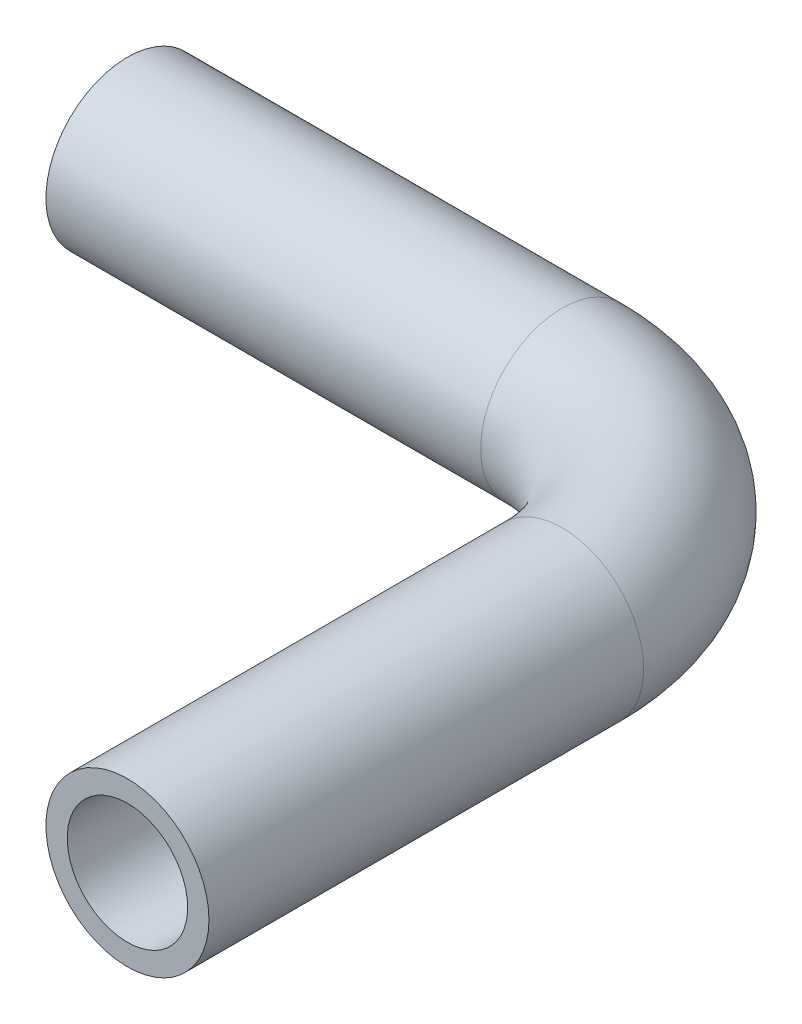
ISO-10303-21;
HEADER;
FILE_DESCRIPTION(('STEP AP214'),'2;1');
FILE_NAME('part.step','',(''),(''),'','','');
FILE_SCHEMA(('AUTOMOTIVE_DESIGN { 1 0 10303 214 1 1 1 1 }'));
ENDSEC;
DATA;
#1=APPLICATION_CONTEXT('core data for automotive mechanical design processes');
#2=APPLICATION_PROTOCOL_DEFINITION('international standard','automotive_design',2000,#1);
#3=PRODUCT_CONTEXT('',#1,'mechanical');
#4=PRODUCT('Part','Part','',(#3));
#5=PRODUCT_RELATED_PRODUCT_CATEGORY('part','',(#4));
#6=PRODUCT_DEFINITION_FORMATION('','',#4);
#7=PRODUCT_DEFINITION_CONTEXT('part definition',#1,'design');
#8=PRODUCT_DEFINITION('design','',#6,#7);
#9=PRODUCT_DEFINITION_SHAPE('','',#8);
#10=(LENGTH_UNIT() NAMED_UNIT(*) SI_UNIT(.MILLI.,.METRE.));
#11=(NAMED_UNIT(*) PLANE_ANGLE_UNIT() SI_UNIT($,.RADIAN.));
#12=(NAMED_UNIT(*) SI_UNIT($,.STERADIAN.) SOLID_ANGLE_UNIT());
#13=UNCERTAINTY_MEASURE_WITH_UNIT(LENGTH_MEASURE(1.E-05),#10,'distance_accuracy_value','');
#14=(GEOMETRIC_REPRESENTATION_CONTEXT(3) GLOBAL_UNCERTAINTY_ASSIGNED_CONTEXT((#13)) GLOBAL_UNIT_ASSIGNED_CONTEXT((#10,
#11,#12)) REPRESENTATION_CONTEXT('',''));
#15=CARTESIAN_POINT('',(0.,0.,0.));
#16=DIRECTION('',(0.,0.,1.));
#17=DIRECTION('',(1.,0.,0.));
#18=AXIS2_PLACEMENT_3D('',#15,#16,#17);
#19=CARTESIAN_POINT('',(-12.7,0.,0.));
#20=DIRECTION('',(1.,0.,0.));
#21=DIRECTION('',(0.,0.,-1.));
#22=AXIS2_PLACEMENT_3D('',#19,#20,#21);
#23=PLANE('',#22);
#24=CARTESIAN_POINT('',(-12.7,0.,0.));
#25=DIRECTION('',(1.,0.,0.));
#26=DIRECTION('',(0.,0.,-1.));
#27=AXIS2_PLACEMENT_3D('',#24,#25,#26);
#28=CIRCLE('',#27,4.7625);
#29=CARTESIAN_POINT('',(-12.7,0.,-4.7625));
#30=VERTEX_POINT('',#29);
#31=EDGE_CURVE('E39',#30,#30,#28,.T.);
#32=ORIENTED_EDGE('',*,*,#31,.F.);
#33=EDGE_LOOP('',(#32));
#34=FACE_BOUND('',#33,.T.);
#35=CARTESIAN_POINT('',(-12.7,0.,0.));
#36=DIRECTION('',(1.,0.,0.));
#37=DIRECTION('',(0.,0.,-1.));
#38=AXIS2_PLACEMENT_3D('',#35,#36,#37);
#39=CIRCLE('',#38,3.5179);
#40=CARTESIAN_POINT('',(-12.7,0.,-3.5179));
#41=VERTEX_POINT('',#40);
#42=EDGE_CURVE('E46',#41,#41,#39,.T.);
#43=ORIENTED_EDGE('',*,*,#42,.T.);
#44=EDGE_LOOP('',(#43));
#45=FACE_BOUND('',#44,.T.);
#46=ADVANCED_FACE('F35',(#34,#45),#23,.F.);
#47=CARTESIAN_POINT('',(12.7,0.,0.));
#48=DIRECTION('',(-1.,0.,0.));
#49=DIRECTION('',(0.,0.,1.));
#50=AXIS2_PLACEMENT_3D('',#47,#48,#49);
#51=CYLINDRICAL_SURFACE('',#50,4.7625);
#52=CARTESIAN_POINT('',(12.7,0.,0.));
#53=DIRECTION('',(1.,0.,0.));
#54=DIRECTION('',(0.,0.,-1.));
#55=AXIS2_PLACEMENT_3D('',#52,#53,#54);
#56=CIRCLE('',#55,4.7625);
#57=CARTESIAN_POINT('',(12.7,0.,-4.7625));
#58=VERTEX_POINT('',#57);
#59=EDGE_CURVE('E10',#58,#58,#56,.T.);
#60=ORIENTED_EDGE('',*,*,#59,.F.);
#61=EDGE_LOOP('',(#60));
#62=FACE_BOUND('',#61,.T.);
#63=ORIENTED_EDGE('',*,*,#31,.T.);
#64=EDGE_LOOP('',(#63));
#65=FACE_BOUND('',#64,.T.);
#66=ADVANCED_FACE('F37',(#62,#65),#51,.T.);
#67=CARTESIAN_POINT('',(12.7,0.,0.));
#68=DIRECTION('',(-1.,0.,0.));
#69=DIRECTION('',(0.,0.,1.));
#70=AXIS2_PLACEMENT_3D('',#67,#68,#69);
#71=CYLINDRICAL_SURFACE('',#70,3.5179);
#72=CARTESIAN_POINT('',(12.7,0.,0.));
#73=DIRECTION('',(1.,0.,0.));
#74=DIRECTION('',(0.,0.,-1.));
#75=AXIS2_PLACEMENT_3D('',#72,#73,#74);
#76=CIRCLE('',#75,3.5179);
#77=CARTESIAN_POINT('',(12.7,0.,-3.5179));
#78=VERTEX_POINT('',#77);
#79=EDGE_CURVE('E54',#78,#78,#76,.F.);
#80=ORIENTED_EDGE('',*,*,#79,.F.);
#81=EDGE_LOOP('',(#80));
#82=FACE_BOUND('',#81,.T.);
#83=ORIENTED_EDGE('',*,*,#42,.F.);
#84=EDGE_LOOP('',(#83));
#85=FACE_BOUND('',#84,.T.);
#86=ADVANCED_FACE('F84',(#82,#85),#71,.F.);
#87=CARTESIAN_POINT('',(12.7,0.,11.1125));
#88=DIRECTION('',(0.,-1.,0.));
#89=DIRECTION('',(0.,0.,-1.));
#90=AXIS2_PLACEMENT_3D('',#87,#88,#89);
#91=TOROIDAL_SURFACE('',#90,11.1125,4.7625);
#92=CARTESIAN_POINT('',(23.8125,0.,11.1125));
#93=DIRECTION('',(0.,0.,1.));
#94=DIRECTION('',(1.,0.,0.));
#95=AXIS2_PLACEMENT_3D('',#92,#93,#94);
#96=CIRCLE('',#95,4.7625);
#97=CARTESIAN_POINT('',(28.575,0.,11.1125));
#98=VERTEX_POINT('',#97);
#99=EDGE_CURVE('E51',#98,#98,#96,.T.);
#100=CARTESIAN_POINT('',(12.7,0.,11.1125));
#101=DIRECTION('',(0.,-1.,0.));
#102=DIRECTION('',(0.,0.,-1.));
#103=AXIS2_PLACEMENT_3D('',#100,#101,#102);
#104=CIRCLE('',#103,15.875);
#105=EDGE_CURVE('',#58,#98,#104,.T.);
#106=ORIENTED_EDGE('',*,*,#59,.T.);
#107=ORIENTED_EDGE('',*,*,#99,.F.);
#108=ORIENTED_EDGE('',*,*,#105,.T.);
#109=ORIENTED_EDGE('',*,*,#105,.F.);
#110=EDGE_LOOP('',(#106,#108,#107,#109));
#111=FACE_BOUND('',#110,.T.);
#112=ADVANCED_FACE('F75',(#111),#91,.T.);
#113=CARTESIAN_POINT('',(12.7,0.,11.1125));
#114=DIRECTION('',(0.,-1.,0.));
#115=DIRECTION('',(0.,0.,-1.));
#116=AXIS2_PLACEMENT_3D('',#113,#114,#115);
#117=TOROIDAL_SURFACE('',#116,11.1125,3.5179);
#118=CARTESIAN_POINT('',(23.8125,0.,11.1125));
#119=DIRECTION('',(0.,0.,1.));
#120=DIRECTION('',(1.,0.,0.));
#121=AXIS2_PLACEMENT_3D('',#118,#119,#120);
#122=CIRCLE('',#121,3.5179);
#123=CARTESIAN_POINT('',(27.3304,0.,11.1125));
#124=VERTEX_POINT('',#123);
#125=EDGE_CURVE('E50',#124,#124,#122,.F.);
#126=CARTESIAN_POINT('',(12.7,0.,11.1125));
#127=DIRECTION('',(0.,-1.,0.));
#128=DIRECTION('',(0.,0.,-1.));
#129=AXIS2_PLACEMENT_3D('',#126,#127,#128);
#130=CIRCLE('',#129,14.6304);
#131=EDGE_CURVE('',#78,#124,#130,.T.);
#132=ORIENTED_EDGE('',*,*,#79,.T.);
#133=ORIENTED_EDGE('',*,*,#125,.F.);
#134=ORIENTED_EDGE('',*,*,#131,.T.);
#135=ORIENTED_EDGE('',*,*,#131,.F.);
#136=EDGE_LOOP('',(#132,#134,#133,#135));
#137=FACE_BOUND('',#136,.T.);
#138=ADVANCED_FACE('F72',(#137),#117,.F.);
#139=CARTESIAN_POINT('',(23.8125,0.,36.5125));
#140=DIRECTION('',(0.,0.,1.));
#141=DIRECTION('',(1.,0.,0.));
#142=AXIS2_PLACEMENT_3D('',#139,#140,#141);
#143=PLANE('',#142);
#144=CARTESIAN_POINT('',(23.8125,0.,36.5125));
#145=DIRECTION('',(0.,0.,1.));
#146=DIRECTION('',(1.,0.,0.));
#147=AXIS2_PLACEMENT_3D('',#144,#145,#146);
#148=CIRCLE('',#147,4.76250000000001);
#149=CARTESIAN_POINT('',(28.575,0.,36.5125));
#150=VERTEX_POINT('',#149);
#151=EDGE_CURVE('E55',#150,#150,#148,.T.);
#152=ORIENTED_EDGE('',*,*,#151,.T.);
#153=EDGE_LOOP('',(#152));
#154=FACE_BOUND('',#153,.T.);
#155=CARTESIAN_POINT('',(23.8125,0.,36.5125));
#156=DIRECTION('',(0.,0.,1.));
#157=DIRECTION('',(1.,0.,0.));
#158=AXIS2_PLACEMENT_3D('',#155,#156,#157);
#159=CIRCLE('',#158,3.51790000000004);
#160=CARTESIAN_POINT('',(27.3304,0.,36.5125));
#161=VERTEX_POINT('',#160);
#162=EDGE_CURVE('E62',#161,#161,#159,.T.);
#163=ORIENTED_EDGE('',*,*,#162,.F.);
#164=EDGE_LOOP('',(#163));
#165=FACE_BOUND('',#164,.T.);
#166=ADVANCED_FACE('F69',(#154,#165),#143,.T.);
#167=CARTESIAN_POINT('',(23.8125,0.,36.5125));
#168=DIRECTION('',(0.,0.,-1.));
#169=DIRECTION('',(-1.,0.,0.));
#170=AXIS2_PLACEMENT_3D('',#167,#168,#169);
#171=CYLINDRICAL_SURFACE('',#170,4.76250000000001);
#172=ORIENTED_EDGE('',*,*,#151,.F.);
#173=EDGE_LOOP('',(#172));
#174=FACE_BOUND('',#173,.T.);
#175=ORIENTED_EDGE('',*,*,#99,.T.);
#176=EDGE_LOOP('',(#175));
#177=FACE_BOUND('',#176,.T.);
#178=ADVANCED_FACE('F71',(#174,#177),#171,.T.);
#179=CARTESIAN_POINT('',(23.8125,0.,36.5125));
#180=DIRECTION('',(0.,0.,-1.));
#181=DIRECTION('',(-1.,0.,0.));
#182=AXIS2_PLACEMENT_3D('',#179,#180,#181);
#183=CYLINDRICAL_SURFACE('',#182,3.51790000000004);
#184=ORIENTED_EDGE('',*,*,#162,.T.);
#185=EDGE_LOOP('',(#184));
#186=FACE_BOUND('',#185,.T.);
#187=ORIENTED_EDGE('',*,*,#125,.T.);
#188=EDGE_LOOP('',(#187));
#189=FACE_BOUND('',#188,.T.);
#190=ADVANCED_FACE('F66',(#186,#189),#183,.F.);
#191=CLOSED_SHELL('',(#46,#66,#86,#112,#138,#166,#178,#190));
#192=MANIFOLD_SOLID_BREP('B2',#191);
#193=ADVANCED_BREP_SHAPE_REPRESENTATION('',(#18,#192),#14);
#194=SHAPE_DEFINITION_REPRESENTATION(#9,#193);
ENDSEC;
END-ISO-10303-21;
